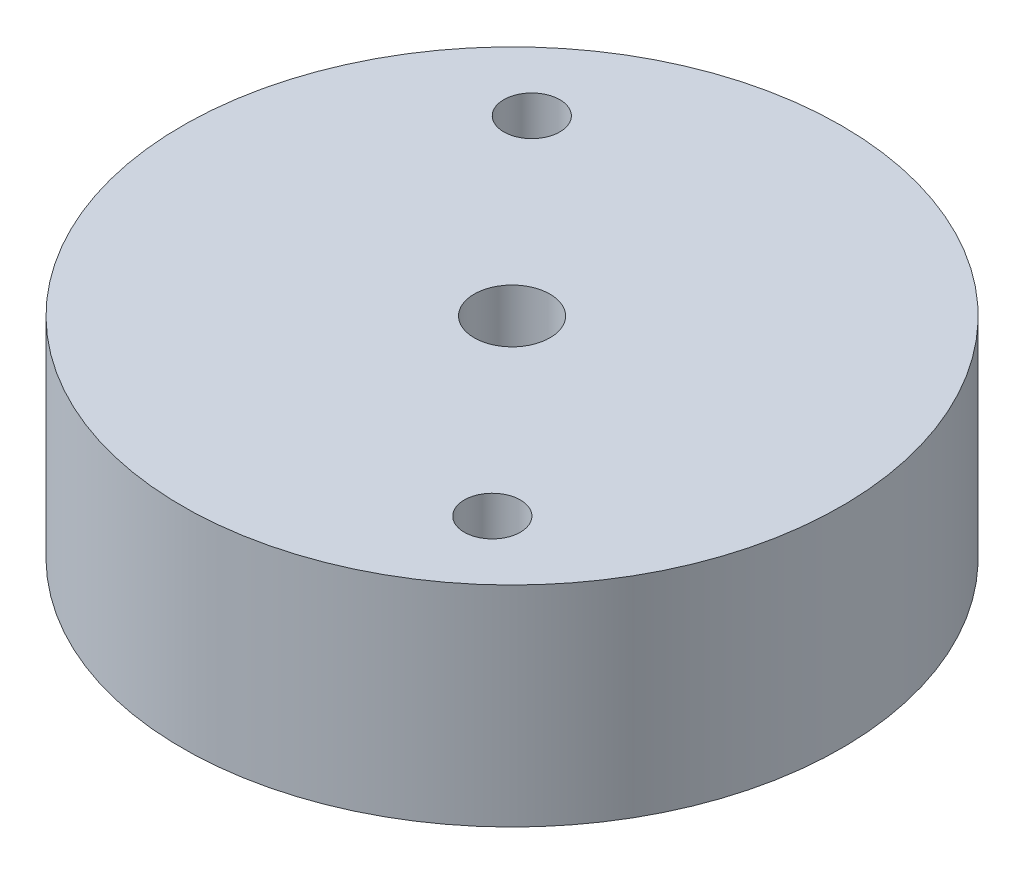
ISO-10303-21;
HEADER;
FILE_DESCRIPTION(('STEP AP214'),'2;1');
FILE_NAME('part.step','',(''),(''),'','','');
FILE_SCHEMA(('AUTOMOTIVE_DESIGN { 1 0 10303 214 1 1 1 1 }'));
ENDSEC;
DATA;
#1=APPLICATION_CONTEXT('core data for automotive mechanical design processes');
#2=APPLICATION_PROTOCOL_DEFINITION('international standard','automotive_design',2000,#1);
#3=PRODUCT_CONTEXT('',#1,'mechanical');
#4=PRODUCT('Part','Part','',(#3));
#5=PRODUCT_RELATED_PRODUCT_CATEGORY('part','',(#4));
#6=PRODUCT_DEFINITION_FORMATION('','',#4);
#7=PRODUCT_DEFINITION_CONTEXT('part definition',#1,'design');
#8=PRODUCT_DEFINITION('design','',#6,#7);
#9=PRODUCT_DEFINITION_SHAPE('','',#8);
#10=(LENGTH_UNIT() NAMED_UNIT(*) SI_UNIT(.MILLI.,.METRE.));
#11=(NAMED_UNIT(*) PLANE_ANGLE_UNIT() SI_UNIT($,.RADIAN.));
#12=(NAMED_UNIT(*) SI_UNIT($,.STERADIAN.) SOLID_ANGLE_UNIT());
#13=UNCERTAINTY_MEASURE_WITH_UNIT(LENGTH_MEASURE(1.E-05),#10,'distance_accuracy_value','');
#14=(GEOMETRIC_REPRESENTATION_CONTEXT(3) GLOBAL_UNCERTAINTY_ASSIGNED_CONTEXT((#13)) GLOBAL_UNIT_ASSIGNED_CONTEXT((#10,
#11,#12)) REPRESENTATION_CONTEXT('',''));
#15=CARTESIAN_POINT('',(0.,0.,0.));
#16=DIRECTION('',(0.,0.,1.));
#17=DIRECTION('',(1.,0.,0.));
#18=AXIS2_PLACEMENT_3D('',#15,#16,#17);
#19=CARTESIAN_POINT('',(0.,6.36,0.));
#20=DIRECTION('',(0.,-1.,0.));
#21=DIRECTION('',(0.,0.,-1.));
#22=AXIS2_PLACEMENT_3D('',#19,#20,#21);
#23=CYLINDRICAL_SURFACE('',#22,10.);
#24=CARTESIAN_POINT('',(0.,6.36,0.));
#25=DIRECTION('',(0.,1.,0.));
#26=DIRECTION('',(0.,0.,1.));
#27=AXIS2_PLACEMENT_3D('',#24,#25,#26);
#28=CIRCLE('',#27,10.);
#29=CARTESIAN_POINT('',(0.,6.36,-10.));
#30=VERTEX_POINT('',#29);
#31=EDGE_CURVE('E12',#30,#30,#28,.T.);
#32=CARTESIAN_POINT('',(0.,0.,0.));
#33=DIRECTION('',(0.,1.,0.));
#34=DIRECTION('',(0.,0.,1.));
#35=AXIS2_PLACEMENT_3D('',#32,#33,#34);
#36=CIRCLE('',#35,10.);
#37=CARTESIAN_POINT('',(0.,0.,-10.));
#38=VERTEX_POINT('',#37);
#39=EDGE_CURVE('E47',#38,#38,#36,.T.);
#40=CARTESIAN_POINT('',(0.,6.36,-10.));
#41=CARTESIAN_POINT('',(0.,6.29375,-10.));
#42=CARTESIAN_POINT('',(0.,6.2275,-10.));
#43=CARTESIAN_POINT('',(0.,6.095,-10.));
#44=CARTESIAN_POINT('',(0.,6.02875,-10.));
#45=CARTESIAN_POINT('',(0.,5.89625,-10.));
#46=CARTESIAN_POINT('',(0.,5.83,-10.));
#47=CARTESIAN_POINT('',(0.,5.6975,-10.));
#48=CARTESIAN_POINT('',(0.,5.63125,-10.));
#49=CARTESIAN_POINT('',(0.,5.49875,-10.));
#50=CARTESIAN_POINT('',(0.,5.4325,-10.));
#51=CARTESIAN_POINT('',(0.,5.3,-10.));
#52=CARTESIAN_POINT('',(0.,5.23375,-10.));
#53=CARTESIAN_POINT('',(0.,5.10125,-10.));
#54=CARTESIAN_POINT('',(0.,5.035,-10.));
#55=CARTESIAN_POINT('',(0.,4.9025,-10.));
#56=CARTESIAN_POINT('',(0.,4.83625,-10.));
#57=CARTESIAN_POINT('',(0.,4.70375,-10.));
#58=CARTESIAN_POINT('',(0.,4.6375,-10.));
#59=CARTESIAN_POINT('',(0.,4.505,-10.));
#60=CARTESIAN_POINT('',(0.,4.43875,-10.));
#61=CARTESIAN_POINT('',(0.,4.30625,-10.));
#62=CARTESIAN_POINT('',(0.,4.24,-10.));
#63=CARTESIAN_POINT('',(0.,4.1075,-10.));
#64=CARTESIAN_POINT('',(0.,4.04125,-10.));
#65=CARTESIAN_POINT('',(0.,3.90875,-10.));
#66=CARTESIAN_POINT('',(0.,3.8425,-10.));
#67=CARTESIAN_POINT('',(0.,3.71,-10.));
#68=CARTESIAN_POINT('',(0.,3.64375,-10.));
#69=CARTESIAN_POINT('',(0.,3.51125,-10.));
#70=CARTESIAN_POINT('',(0.,3.445,-10.));
#71=CARTESIAN_POINT('',(0.,3.3125,-10.));
#72=CARTESIAN_POINT('',(0.,3.24625,-10.));
#73=CARTESIAN_POINT('',(0.,3.11375,-10.));
#74=CARTESIAN_POINT('',(0.,3.0475,-10.));
#75=CARTESIAN_POINT('',(0.,2.915,-10.));
#76=CARTESIAN_POINT('',(0.,2.84875,-10.));
#77=CARTESIAN_POINT('',(0.,2.71625,-10.));
#78=CARTESIAN_POINT('',(0.,2.65,-10.));
#79=CARTESIAN_POINT('',(0.,2.5175,-10.));
#80=CARTESIAN_POINT('',(0.,2.45125,-10.));
#81=CARTESIAN_POINT('',(0.,2.31875,-10.));
#82=CARTESIAN_POINT('',(0.,2.2525,-10.));
#83=CARTESIAN_POINT('',(0.,2.12,-10.));
#84=CARTESIAN_POINT('',(0.,2.05375,-10.));
#85=CARTESIAN_POINT('',(0.,1.92125,-10.));
#86=CARTESIAN_POINT('',(0.,1.855,-10.));
#87=CARTESIAN_POINT('',(0.,1.7225,-10.));
#88=CARTESIAN_POINT('',(0.,1.65625,-10.));
#89=CARTESIAN_POINT('',(0.,1.52375,-10.));
#90=CARTESIAN_POINT('',(0.,1.4575,-10.));
#91=CARTESIAN_POINT('',(0.,1.325,-10.));
#92=CARTESIAN_POINT('',(0.,1.25875,-10.));
#93=CARTESIAN_POINT('',(0.,1.12625,-10.));
#94=CARTESIAN_POINT('',(0.,1.06,-10.));
#95=CARTESIAN_POINT('',(0.,0.9275,-10.));
#96=CARTESIAN_POINT('',(0.,0.86125,-10.));
#97=CARTESIAN_POINT('',(0.,0.728750000000001,-10.));
#98=CARTESIAN_POINT('',(0.,0.662500000000001,-10.));
#99=CARTESIAN_POINT('',(0.,0.53,-10.));
#100=CARTESIAN_POINT('',(0.,0.46375,-10.));
#101=CARTESIAN_POINT('',(0.,0.33125,-10.));
#102=CARTESIAN_POINT('',(0.,0.265,-10.));
#103=CARTESIAN_POINT('',(0.,0.1325,-10.));
#104=CARTESIAN_POINT('',(0.,0.06625,-10.));
#105=CARTESIAN_POINT('',(0.,0.,-10.));
#106=B_SPLINE_CURVE_WITH_KNOTS('',3,(#40,#41,#42,#43,#44,#45,#46,#47,#48,#49,#50,#51,#52,#53,
#54,#55,#56,#57,#58,#59,#60,#61,#62,#63,#64,#65,#66,#67,#68,#69,#70,#71,#72,#73,#74,#75,#76,#77,
#78,#79,#80,#81,#82,#83,#84,#85,#86,#87,#88,#89,#90,#91,#92,#93,#94,#95,#96,#97,#98,#99,#100,
#101,#102,#103,#104,#105),.UNSPECIFIED.,.F.,.F.,(4,2,2,2,2,2,2,2,2,2,2,2,2,2,2,2,2,2,2,2,2,2,2,
2,2,2,2,2,2,2,2,2,4),(0.,0.19875,0.3975,0.59625,0.795000000000001,0.993750000000001,1.1925,
1.39125,1.59,1.78875,1.9875,2.18625,2.385,2.58375,2.7825,2.98125,3.18,3.37875,3.5775,3.77625,
3.975,4.17375,4.3725,4.57125,4.77,4.96875,5.1675,5.36625,5.565,5.76375,5.9625,6.16125,6.36),.UNSPECIFIED.);
#107=EDGE_CURVE('BSEAM44',#30,#38,#106,.T.);
#108=ORIENTED_EDGE('',*,*,#31,.F.);
#109=ORIENTED_EDGE('',*,*,#39,.T.);
#110=ORIENTED_EDGE('',*,*,#107,.T.);
#111=ORIENTED_EDGE('',*,*,#107,.F.);
#112=EDGE_LOOP('',(#108,#110,#109,#111));
#113=FACE_BOUND('',#112,.T.);
#114=ADVANCED_FACE('F44',(#113),#23,.T.);
#115=CARTESIAN_POINT('',(0.,6.36,0.));
#116=DIRECTION('',(0.,1.,0.));
#117=DIRECTION('',(0.,0.,1.));
#118=AXIS2_PLACEMENT_3D('',#115,#116,#117);
#119=PLANE('',#118);
#120=CARTESIAN_POINT('',(-4.95981865136873,6.36,-5.55901960290973));
#121=DIRECTION('',(0.,1.,0.));
#122=DIRECTION('',(0.,0.,1.));
#123=AXIS2_PLACEMENT_3D('',#120,#121,#122);
#124=CIRCLE('',#123,0.849999999999998);
#125=CARTESIAN_POINT('',(-4.95981865136873,6.36,-4.70901960290973));
#126=VERTEX_POINT('',#125);
#127=EDGE_CURVE('E70',#126,#126,#124,.T.);
#128=ORIENTED_EDGE('',*,*,#127,.F.);
#129=EDGE_LOOP('',(#128));
#130=FACE_BOUND('',#129,.T.);
#131=CARTESIAN_POINT('',(4.95981865136865,6.36,5.55901960290984));
#132=DIRECTION('',(0.,1.,0.));
#133=DIRECTION('',(0.,0.,1.));
#134=AXIS2_PLACEMENT_3D('',#131,#132,#133);
#135=CIRCLE('',#134,0.85);
#136=CARTESIAN_POINT('',(4.95981865136865,6.36,6.40901960290984));
#137=VERTEX_POINT('',#136);
#138=EDGE_CURVE('E64',#137,#137,#135,.T.);
#139=ORIENTED_EDGE('',*,*,#138,.F.);
#140=EDGE_LOOP('',(#139));
#141=FACE_BOUND('',#140,.T.);
#142=CARTESIAN_POINT('',(0.,6.36,0.));
#143=DIRECTION('',(0.,1.,0.));
#144=DIRECTION('',(0.,0.,1.));
#145=AXIS2_PLACEMENT_3D('',#142,#143,#144);
#146=CIRCLE('',#145,1.15);
#147=CARTESIAN_POINT('',(0.,6.36,1.15));
#148=VERTEX_POINT('',#147);
#149=EDGE_CURVE('E58',#148,#148,#146,.T.);
#150=ORIENTED_EDGE('',*,*,#149,.F.);
#151=EDGE_LOOP('',(#150));
#152=FACE_BOUND('',#151,.T.);
#153=ORIENTED_EDGE('',*,*,#31,.T.);
#154=EDGE_LOOP('',(#153));
#155=FACE_BOUND('',#154,.T.);
#156=ADVANCED_FACE('F77',(#130,#141,#152,#155),#119,.T.);
#157=CARTESIAN_POINT('',(0.,0.,0.));
#158=DIRECTION('',(0.,1.,0.));
#159=DIRECTION('',(0.,0.,1.));
#160=AXIS2_PLACEMENT_3D('',#157,#158,#159);
#161=PLANE('',#160);
#162=CARTESIAN_POINT('',(-4.95981865136873,0.,-5.55901960290973));
#163=DIRECTION('',(0.,1.,0.));
#164=DIRECTION('',(0.,0.,1.));
#165=AXIS2_PLACEMENT_3D('',#162,#163,#164);
#166=CIRCLE('',#165,0.849999999999998);
#167=CARTESIAN_POINT('',(-4.95981865136873,0.,-4.70901960290973));
#168=VERTEX_POINT('',#167);
#169=EDGE_CURVE('E67',#168,#168,#166,.F.);
#170=ORIENTED_EDGE('',*,*,#169,.F.);
#171=EDGE_LOOP('',(#170));
#172=FACE_BOUND('',#171,.T.);
#173=CARTESIAN_POINT('',(4.95981865136865,0.,5.55901960290984));
#174=DIRECTION('',(0.,1.,0.));
#175=DIRECTION('',(0.,0.,1.));
#176=AXIS2_PLACEMENT_3D('',#173,#174,#175);
#177=CIRCLE('',#176,0.85);
#178=CARTESIAN_POINT('',(4.95981865136865,0.,6.40901960290984));
#179=VERTEX_POINT('',#178);
#180=EDGE_CURVE('E61',#179,#179,#177,.F.);
#181=ORIENTED_EDGE('',*,*,#180,.F.);
#182=EDGE_LOOP('',(#181));
#183=FACE_BOUND('',#182,.T.);
#184=CARTESIAN_POINT('',(0.,0.,0.));
#185=DIRECTION('',(0.,1.,0.));
#186=DIRECTION('',(0.,0.,1.));
#187=AXIS2_PLACEMENT_3D('',#184,#185,#186);
#188=CIRCLE('',#187,1.15);
#189=CARTESIAN_POINT('',(0.,0.,1.15));
#190=VERTEX_POINT('',#189);
#191=EDGE_CURVE('E54',#190,#190,#188,.F.);
#192=ORIENTED_EDGE('',*,*,#191,.F.);
#193=EDGE_LOOP('',(#192));
#194=FACE_BOUND('',#193,.T.);
#195=ORIENTED_EDGE('',*,*,#39,.F.);
#196=EDGE_LOOP('',(#195));
#197=FACE_BOUND('',#196,.T.);
#198=ADVANCED_FACE('F80',(#172,#183,#194,#197),#161,.F.);
#199=CARTESIAN_POINT('',(0.,-3.25269119345812,0.));
#200=DIRECTION('',(0.,1.,0.));
#201=DIRECTION('',(0.,0.,1.));
#202=AXIS2_PLACEMENT_3D('',#199,#200,#201);
#203=CYLINDRICAL_SURFACE('',#202,1.15);
#204=ORIENTED_EDGE('',*,*,#191,.T.);
#205=EDGE_LOOP('',(#204));
#206=FACE_BOUND('',#205,.T.);
#207=ORIENTED_EDGE('',*,*,#149,.T.);
#208=EDGE_LOOP('',(#207));
#209=FACE_BOUND('',#208,.T.);
#210=ADVANCED_FACE('F86',(#206,#209),#203,.F.);
#211=CARTESIAN_POINT('',(4.95981865136865,-0.00100000000000013,5.55901960290984));
#212=DIRECTION('',(0.,1.,0.));
#213=DIRECTION('',(0.,0.,1.));
#214=AXIS2_PLACEMENT_3D('',#211,#212,#213);
#215=CYLINDRICAL_SURFACE('',#214,0.85);
#216=ORIENTED_EDGE('',*,*,#138,.T.);
#217=EDGE_LOOP('',(#216));
#218=FACE_BOUND('',#217,.T.);
#219=ORIENTED_EDGE('',*,*,#180,.T.);
#220=EDGE_LOOP('',(#219));
#221=FACE_BOUND('',#220,.T.);
#222=ADVANCED_FACE('F88',(#218,#221),#215,.F.);
#223=CARTESIAN_POINT('',(-4.95981865136873,-0.00100000000000013,-5.55901960290973));
#224=DIRECTION('',(0.,1.,0.));
#225=DIRECTION('',(0.,0.,1.));
#226=AXIS2_PLACEMENT_3D('',#223,#224,#225);
#227=CYLINDRICAL_SURFACE('',#226,0.849999999999998);
#228=ORIENTED_EDGE('',*,*,#127,.T.);
#229=EDGE_LOOP('',(#228));
#230=FACE_BOUND('',#229,.T.);
#231=ORIENTED_EDGE('',*,*,#169,.T.);
#232=EDGE_LOOP('',(#231));
#233=FACE_BOUND('',#232,.T.);
#234=ADVANCED_FACE('F74',(#230,#233),#227,.F.);
#235=CLOSED_SHELL('',(#114,#156,#198,#210,#222,#234));
#236=MANIFOLD_SOLID_BREP('B2',#235);
#237=ADVANCED_BREP_SHAPE_REPRESENTATION('',(#18,#236),#14);
#238=SHAPE_DEFINITION_REPRESENTATION(#9,#237);
ENDSEC;
END-ISO-10303-21;
